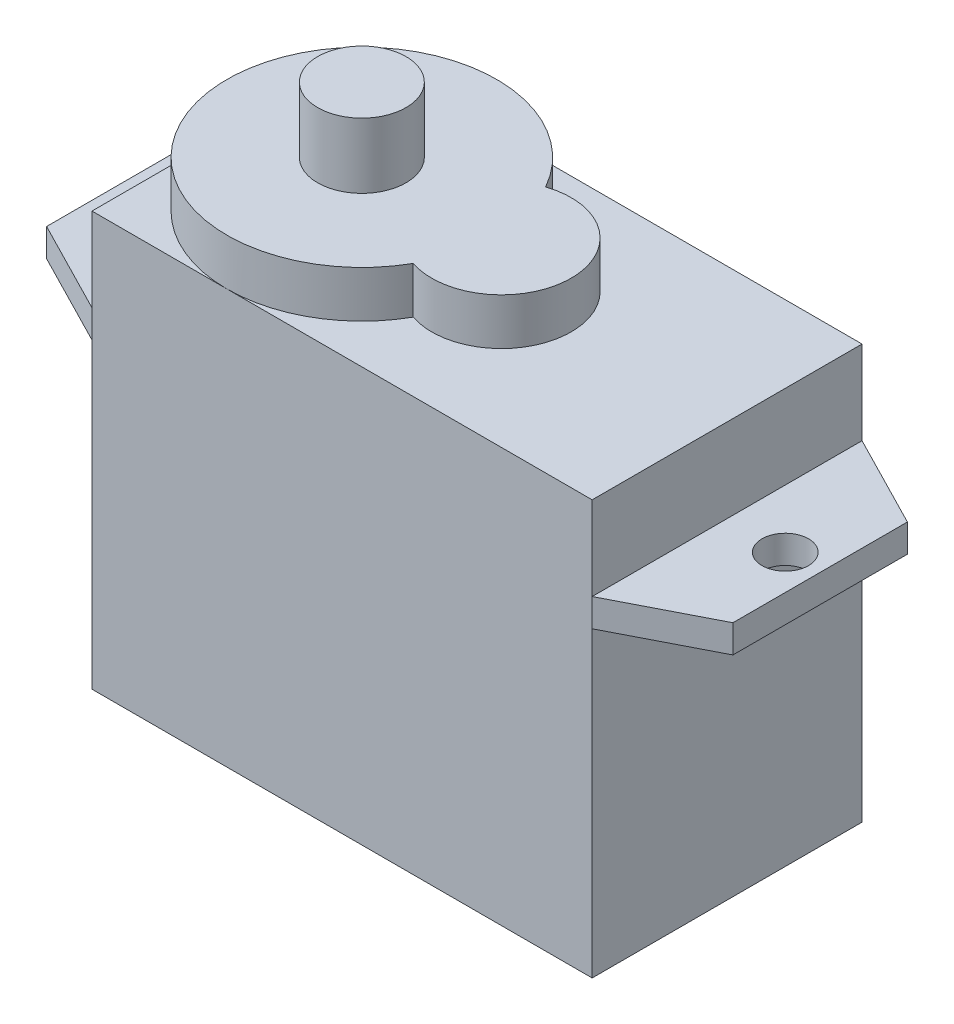
ISO-10303-21;
HEADER;
FILE_DESCRIPTION(('STEP AP214'),'2;1');
FILE_NAME('part.step','',(''),(''),'','','');
FILE_SCHEMA(('AUTOMOTIVE_DESIGN { 1 0 10303 214 1 1 1 1 }'));
ENDSEC;
DATA;
#1=APPLICATION_CONTEXT('core data for automotive mechanical design processes');
#2=APPLICATION_PROTOCOL_DEFINITION('international standard','automotive_design',2000,#1);
#3=PRODUCT_CONTEXT('',#1,'mechanical');
#4=PRODUCT('Part','Part','',(#3));
#5=PRODUCT_RELATED_PRODUCT_CATEGORY('part','',(#4));
#6=PRODUCT_DEFINITION_FORMATION('','',#4);
#7=PRODUCT_DEFINITION_CONTEXT('part definition',#1,'design');
#8=PRODUCT_DEFINITION('design','',#6,#7);
#9=PRODUCT_DEFINITION_SHAPE('','',#8);
#10=(LENGTH_UNIT() NAMED_UNIT(*) SI_UNIT(.MILLI.,.METRE.));
#11=(NAMED_UNIT(*) PLANE_ANGLE_UNIT() SI_UNIT($,.RADIAN.));
#12=(NAMED_UNIT(*) SI_UNIT($,.STERADIAN.) SOLID_ANGLE_UNIT());
#13=UNCERTAINTY_MEASURE_WITH_UNIT(LENGTH_MEASURE(1.E-05),#10,'distance_accuracy_value','');
#14=(GEOMETRIC_REPRESENTATION_CONTEXT(3) GLOBAL_UNCERTAINTY_ASSIGNED_CONTEXT((#13)) GLOBAL_UNIT_ASSIGNED_CONTEXT((#10,
#11,#12)) REPRESENTATION_CONTEXT('',''));
#15=CARTESIAN_POINT('',(0.,0.,0.));
#16=DIRECTION('',(0.,0.,1.));
#17=DIRECTION('',(1.,0.,0.));
#18=AXIS2_PLACEMENT_3D('',#15,#16,#17);
#19=CARTESIAN_POINT('',(0.,17.8,0.));
#20=DIRECTION('',(0.,1.,0.));
#21=DIRECTION('',(0.,0.,1.));
#22=AXIS2_PLACEMENT_3D('',#19,#20,#21);
#23=PLANE('',#22);
#24=CARTESIAN_POINT('',(1.05,17.8,0.));
#25=DIRECTION('',(0.,1.,0.));
#26=DIRECTION('',(0.,0.,1.));
#27=AXIS2_PLACEMENT_3D('',#24,#25,#26);
#28=CIRCLE('',#27,3.);
#29=CARTESIAN_POINT('',(0.103333333333326,17.8,2.84672131095094));
#30=VERTEX_POINT('',#29);
#31=CARTESIAN_POINT('',(0.103333333333326,17.8,-2.84672131095094));
#32=VERTEX_POINT('',#31);
#33=EDGE_CURVE('E161',#30,#32,#28,.T.);
#34=ORIENTED_EDGE('',*,*,#33,.F.);
#35=CARTESIAN_POINT('',(-4.95,17.8,0.));
#36=DIRECTION('',(0.,1.,0.));
#37=DIRECTION('',(0.,0.,1.));
#38=AXIS2_PLACEMENT_3D('',#35,#36,#37);
#39=CIRCLE('',#38,5.8);
#40=CARTESIAN_POINT('',(-4.95,17.8,5.8));
#41=VERTEX_POINT('',#40);
#42=EDGE_CURVE('E286',#41,#30,#39,.T.);
#43=ORIENTED_EDGE('',*,*,#42,.F.);
#44=DIRECTION('',(1.,0.,0.));
#45=VECTOR('',#44,1.);
#46=CARTESIAN_POINT('',(-10.75,17.8,5.8));
#47=LINE('',#46,#45);
#48=CARTESIAN_POINT('',(10.75,17.8,5.8));
#49=VERTEX_POINT('',#48);
#50=EDGE_CURVE('E171',#41,#49,#47,.T.);
#51=ORIENTED_EDGE('',*,*,#50,.T.);
#52=DIRECTION('',(0.,0.,-1.));
#53=VECTOR('',#52,1.);
#54=CARTESIAN_POINT('',(10.75,17.8,-5.8));
#55=LINE('',#54,#53);
#56=CARTESIAN_POINT('',(10.75,17.8,-5.8));
#57=VERTEX_POINT('',#56);
#58=EDGE_CURVE('E176',#49,#57,#55,.T.);
#59=ORIENTED_EDGE('',*,*,#58,.T.);
#60=DIRECTION('',(-1.,0.,0.));
#61=VECTOR('',#60,1.);
#62=CARTESIAN_POINT('',(-10.75,17.8,-5.8));
#63=LINE('',#62,#61);
#64=CARTESIAN_POINT('',(-4.95,17.8,-5.8));
#65=VERTEX_POINT('',#64);
#66=EDGE_CURVE('E179',#57,#65,#63,.T.);
#67=ORIENTED_EDGE('',*,*,#66,.T.);
#68=EDGE_CURVE('E44',#32,#65,#39,.T.);
#69=ORIENTED_EDGE('',*,*,#68,.F.);
#70=EDGE_LOOP('',(#34,#43,#51,#59,#67,#69));
#71=FACE_BOUND('',#70,.T.);
#72=ADVANCED_FACE('F33',(#71),#23,.T.);
#73=CARTESIAN_POINT('',(-10.75,17.8,0.));
#74=VERTEX_POINT('',#73);
#75=EDGE_CURVE('E11',#65,#74,#39,.T.);
#76=ORIENTED_EDGE('',*,*,#75,.F.);
#77=CARTESIAN_POINT('',(-10.75,17.8,-5.8));
#78=VERTEX_POINT('',#77);
#79=EDGE_CURVE('E178',#65,#78,#63,.T.);
#80=ORIENTED_EDGE('',*,*,#79,.T.);
#81=DIRECTION('',(0.,0.,1.));
#82=VECTOR('',#81,1.);
#83=CARTESIAN_POINT('',(-10.75,17.8,-5.8));
#84=LINE('',#83,#82);
#85=EDGE_CURVE('E169',#78,#74,#84,.T.);
#86=ORIENTED_EDGE('',*,*,#85,.T.);
#87=EDGE_LOOP('',(#76,#80,#86));
#88=FACE_BOUND('',#87,.T.);
#89=ADVANCED_FACE('F313',(#88),#23,.T.);
#90=CARTESIAN_POINT('',(0.,14.2,0.));
#91=DIRECTION('',(0.,1.,0.));
#92=DIRECTION('',(0.,0.,1.));
#93=AXIS2_PLACEMENT_3D('',#90,#91,#92);
#94=PLANE('',#93);
#95=DIRECTION('',(0.,0.,1.));
#96=VECTOR('',#95,1.);
#97=CARTESIAN_POINT('',(-10.75,14.2,-5.8));
#98=LINE('',#97,#96);
#99=CARTESIAN_POINT('',(-10.75,14.2,-5.8));
#100=VERTEX_POINT('',#99);
#101=CARTESIAN_POINT('',(-10.75,14.2,5.8));
#102=VERTEX_POINT('',#101);
#103=EDGE_CURVE('E162',#100,#102,#98,.T.);
#104=ORIENTED_EDGE('',*,*,#103,.F.);
#105=DIRECTION('',(-0.889933250556876,0.,0.456090790910399));
#106=VECTOR('',#105,1.);
#107=CARTESIAN_POINT('',(-10.75,14.2,-5.8));
#108=LINE('',#107,#106);
#109=CARTESIAN_POINT('',(-14.75,14.2,-3.75));
#110=VERTEX_POINT('',#109);
#111=EDGE_CURVE('E217',#100,#110,#108,.T.);
#112=ORIENTED_EDGE('',*,*,#111,.T.);
#113=DIRECTION('',(0.,0.,1.));
#114=VECTOR('',#113,1.);
#115=CARTESIAN_POINT('',(-14.75,14.2,-3.75));
#116=LINE('',#115,#114);
#117=CARTESIAN_POINT('',(-14.75,14.2,3.75));
#118=VERTEX_POINT('',#117);
#119=EDGE_CURVE('E219',#110,#118,#116,.T.);
#120=ORIENTED_EDGE('',*,*,#119,.T.);
#121=DIRECTION('',(0.889933250556876,0.,0.456090790910399));
#122=VECTOR('',#121,1.);
#123=CARTESIAN_POINT('',(-14.75,14.2,3.75));
#124=LINE('',#123,#122);
#125=EDGE_CURVE('E221',#118,#102,#124,.T.);
#126=ORIENTED_EDGE('',*,*,#125,.T.);
#127=EDGE_LOOP('',(#104,#112,#120,#126));
#128=FACE_BOUND('',#127,.T.);
#129=CARTESIAN_POINT('',(-13.25,14.2,0.));
#130=DIRECTION('',(0.,1.,0.));
#131=DIRECTION('',(0.,0.,1.));
#132=AXIS2_PLACEMENT_3D('',#129,#130,#131);
#133=CIRCLE('',#132,1.);
#134=CARTESIAN_POINT('',(-13.25,14.2,1.));
#135=VERTEX_POINT('',#134);
#136=EDGE_CURVE('E202',#135,#135,#133,.T.);
#137=ORIENTED_EDGE('',*,*,#136,.F.);
#138=EDGE_LOOP('',(#137));
#139=FACE_BOUND('',#138,.T.);
#140=ADVANCED_FACE('F320',(#128,#139),#94,.T.);
#141=CARTESIAN_POINT('',(10.75,13.,-5.8));
#142=DIRECTION('',(-1.,0.,0.));
#143=DIRECTION('',(0.,0.,1.));
#144=AXIS2_PLACEMENT_3D('',#141,#142,#143);
#145=PLANE('',#144);
#146=DIRECTION('',(0.,0.,-1.));
#147=VECTOR('',#146,1.);
#148=CARTESIAN_POINT('',(10.75,0.,-5.8));
#149=LINE('',#148,#147);
#150=CARTESIAN_POINT('',(10.75,0.,5.8));
#151=VERTEX_POINT('',#150);
#152=CARTESIAN_POINT('',(10.75,0.,-5.8));
#153=VERTEX_POINT('',#152);
#154=EDGE_CURVE('E260',#151,#153,#149,.T.);
#155=ORIENTED_EDGE('',*,*,#154,.T.);
#156=DIRECTION('',(0.,-1.,0.));
#157=VECTOR('',#156,1.);
#158=CARTESIAN_POINT('',(10.75,13.,-5.8));
#159=LINE('',#158,#157);
#160=CARTESIAN_POINT('',(10.75,13.,-5.8));
#161=VERTEX_POINT('',#160);
#162=EDGE_CURVE('E37',#161,#153,#159,.T.);
#163=ORIENTED_EDGE('',*,*,#162,.F.);
#164=DIRECTION('',(0.,0.,-1.));
#165=VECTOR('',#164,1.);
#166=CARTESIAN_POINT('',(10.75,13.,-5.8));
#167=LINE('',#166,#165);
#168=CARTESIAN_POINT('',(10.75,13.,5.8));
#169=VERTEX_POINT('',#168);
#170=EDGE_CURVE('E261',#169,#161,#167,.T.);
#171=ORIENTED_EDGE('',*,*,#170,.F.);
#172=DIRECTION('',(0.,-1.,0.));
#173=VECTOR('',#172,1.);
#174=CARTESIAN_POINT('',(10.75,13.,5.8));
#175=LINE('',#174,#173);
#176=EDGE_CURVE('E268',#169,#151,#175,.T.);
#177=ORIENTED_EDGE('',*,*,#176,.T.);
#178=EDGE_LOOP('',(#155,#163,#171,#177));
#179=FACE_BOUND('',#178,.T.);
#180=ADVANCED_FACE('F35',(#179),#145,.F.);
#181=CARTESIAN_POINT('',(-10.75,13.,-5.8));
#182=DIRECTION('',(0.,0.,1.));
#183=DIRECTION('',(1.,0.,0.));
#184=AXIS2_PLACEMENT_3D('',#181,#182,#183);
#185=PLANE('',#184);
#186=DIRECTION('',(-1.,0.,0.));
#187=VECTOR('',#186,1.);
#188=CARTESIAN_POINT('',(-10.75,0.,-5.8));
#189=LINE('',#188,#187);
#190=CARTESIAN_POINT('',(-10.75,0.,-5.8));
#191=VERTEX_POINT('',#190);
#192=EDGE_CURVE('E271',#153,#191,#189,.T.);
#193=ORIENTED_EDGE('',*,*,#192,.T.);
#194=DIRECTION('',(0.,-1.,0.));
#195=VECTOR('',#194,1.);
#196=CARTESIAN_POINT('',(-10.75,13.,-5.8));
#197=LINE('',#196,#195);
#198=CARTESIAN_POINT('',(-10.75,13.,-5.8));
#199=VERTEX_POINT('',#198);
#200=EDGE_CURVE('E280',#199,#191,#197,.T.);
#201=ORIENTED_EDGE('',*,*,#200,.F.);
#202=DIRECTION('',(0.,-1.,0.));
#203=VECTOR('',#202,1.);
#204=CARTESIAN_POINT('',(-10.75,14.2,-5.8));
#205=LINE('',#204,#203);
#206=EDGE_CURVE('E248',#100,#199,#205,.T.);
#207=ORIENTED_EDGE('',*,*,#206,.F.);
#208=DIRECTION('',(0.,-1.,0.));
#209=VECTOR('',#208,1.);
#210=CARTESIAN_POINT('',(-10.75,17.8,-5.8));
#211=LINE('',#210,#209);
#212=EDGE_CURVE('E180',#78,#100,#211,.T.);
#213=ORIENTED_EDGE('',*,*,#212,.F.);
#214=ORIENTED_EDGE('',*,*,#79,.F.);
#215=ORIENTED_EDGE('',*,*,#66,.F.);
#216=DIRECTION('',(0.,-1.,0.));
#217=VECTOR('',#216,1.);
#218=CARTESIAN_POINT('',(10.75,17.8,-5.8));
#219=LINE('',#218,#217);
#220=CARTESIAN_POINT('',(10.75,14.2,-5.8));
#221=VERTEX_POINT('',#220);
#222=EDGE_CURVE('E186',#57,#221,#219,.T.);
#223=ORIENTED_EDGE('',*,*,#222,.T.);
#224=DIRECTION('',(0.,-1.,0.));
#225=VECTOR('',#224,1.);
#226=CARTESIAN_POINT('',(10.75,14.2,-5.8));
#227=LINE('',#226,#225);
#228=EDGE_CURVE('E251',#221,#161,#227,.T.);
#229=ORIENTED_EDGE('',*,*,#228,.T.);
#230=ORIENTED_EDGE('',*,*,#162,.T.);
#231=EDGE_LOOP('',(#193,#201,#207,#213,#214,#215,#223,#229,#230));
#232=FACE_BOUND('',#231,.T.);
#233=ADVANCED_FACE('F342',(#232),#185,.F.);
#234=CARTESIAN_POINT('',(-10.75,13.,-5.8));
#235=DIRECTION('',(1.,0.,0.));
#236=DIRECTION('',(0.,0.,-1.));
#237=AXIS2_PLACEMENT_3D('',#234,#235,#236);
#238=PLANE('',#237);
#239=DIRECTION('',(0.,0.,1.));
#240=VECTOR('',#239,1.);
#241=CARTESIAN_POINT('',(-10.75,0.,-5.8));
#242=LINE('',#241,#240);
#243=CARTESIAN_POINT('',(-10.75,0.,5.8));
#244=VERTEX_POINT('',#243);
#245=EDGE_CURVE('E273',#191,#244,#242,.T.);
#246=ORIENTED_EDGE('',*,*,#245,.T.);
#247=DIRECTION('',(0.,-1.,0.));
#248=VECTOR('',#247,1.);
#249=CARTESIAN_POINT('',(-10.75,13.,5.8));
#250=LINE('',#249,#248);
#251=CARTESIAN_POINT('',(-10.75,13.,5.8));
#252=VERTEX_POINT('',#251);
#253=EDGE_CURVE('E278',#252,#244,#250,.T.);
#254=ORIENTED_EDGE('',*,*,#253,.F.);
#255=DIRECTION('',(0.,0.,1.));
#256=VECTOR('',#255,1.);
#257=CARTESIAN_POINT('',(-10.75,13.,-5.8));
#258=LINE('',#257,#256);
#259=EDGE_CURVE('E264',#199,#252,#258,.T.);
#260=ORIENTED_EDGE('',*,*,#259,.F.);
#261=ORIENTED_EDGE('',*,*,#200,.T.);
#262=EDGE_LOOP('',(#246,#254,#260,#261));
#263=FACE_BOUND('',#262,.T.);
#264=ADVANCED_FACE('F384',(#263),#238,.F.);
#265=CARTESIAN_POINT('',(-10.75,13.,5.8));
#266=DIRECTION('',(0.,0.,-1.));
#267=DIRECTION('',(-1.,0.,0.));
#268=AXIS2_PLACEMENT_3D('',#265,#266,#267);
#269=PLANE('',#268);
#270=DIRECTION('',(1.,0.,0.));
#271=VECTOR('',#270,1.);
#272=CARTESIAN_POINT('',(-10.75,0.,5.8));
#273=LINE('',#272,#271);
#274=EDGE_CURVE('E265',#244,#151,#273,.T.);
#275=ORIENTED_EDGE('',*,*,#274,.T.);
#276=ORIENTED_EDGE('',*,*,#176,.F.);
#277=DIRECTION('',(0.,-1.,0.));
#278=VECTOR('',#277,1.);
#279=CARTESIAN_POINT('',(10.75,14.2,5.8));
#280=LINE('',#279,#278);
#281=CARTESIAN_POINT('',(10.75,14.2,5.8));
#282=VERTEX_POINT('',#281);
#283=EDGE_CURVE('E223',#282,#169,#280,.T.);
#284=ORIENTED_EDGE('',*,*,#283,.F.);
#285=DIRECTION('',(0.,-1.,0.));
#286=VECTOR('',#285,1.);
#287=CARTESIAN_POINT('',(10.75,17.8,5.8));
#288=LINE('',#287,#286);
#289=EDGE_CURVE('E189',#49,#282,#288,.T.);
#290=ORIENTED_EDGE('',*,*,#289,.F.);
#291=ORIENTED_EDGE('',*,*,#50,.F.);
#292=CARTESIAN_POINT('',(-10.75,17.8,5.8));
#293=VERTEX_POINT('',#292);
#294=EDGE_CURVE('E173',#293,#41,#47,.T.);
#295=ORIENTED_EDGE('',*,*,#294,.F.);
#296=DIRECTION('',(0.,-1.,0.));
#297=VECTOR('',#296,1.);
#298=CARTESIAN_POINT('',(-10.75,17.8,5.8));
#299=LINE('',#298,#297);
#300=EDGE_CURVE('E192',#293,#102,#299,.T.);
#301=ORIENTED_EDGE('',*,*,#300,.T.);
#302=DIRECTION('',(0.,-1.,0.));
#303=VECTOR('',#302,1.);
#304=CARTESIAN_POINT('',(-10.75,14.2,5.8));
#305=LINE('',#304,#303);
#306=EDGE_CURVE('E239',#102,#252,#305,.T.);
#307=ORIENTED_EDGE('',*,*,#306,.T.);
#308=ORIENTED_EDGE('',*,*,#253,.T.);
#309=EDGE_LOOP('',(#275,#276,#284,#290,#291,#295,#301,#307,#308));
#310=FACE_BOUND('',#309,.T.);
#311=ADVANCED_FACE('F355',(#310),#269,.F.);
#312=CARTESIAN_POINT('',(0.,0.,0.));
#313=DIRECTION('',(0.,1.,0.));
#314=DIRECTION('',(0.,0.,1.));
#315=AXIS2_PLACEMENT_3D('',#312,#313,#314);
#316=PLANE('',#315);
#317=ORIENTED_EDGE('',*,*,#154,.F.);
#318=ORIENTED_EDGE('',*,*,#274,.F.);
#319=ORIENTED_EDGE('',*,*,#245,.F.);
#320=ORIENTED_EDGE('',*,*,#192,.F.);
#321=EDGE_LOOP('',(#317,#318,#319,#320));
#322=FACE_BOUND('',#321,.T.);
#323=ADVANCED_FACE('F383',(#322),#316,.F.);
#324=CARTESIAN_POINT('',(0.,13.,0.));
#325=DIRECTION('',(0.,1.,0.));
#326=DIRECTION('',(0.,0.,1.));
#327=AXIS2_PLACEMENT_3D('',#324,#325,#326);
#328=PLANE('',#327);
#329=CARTESIAN_POINT('',(13.25,13.,0.));
#330=DIRECTION('',(0.,1.,0.));
#331=DIRECTION('',(0.,0.,-1.));
#332=AXIS2_PLACEMENT_3D('',#329,#330,#331);
#333=CIRCLE('',#332,1.);
#334=CARTESIAN_POINT('',(13.25,13.,-1.));
#335=VERTEX_POINT('',#334);
#336=EDGE_CURVE('E195',#335,#335,#333,.T.);
#337=ORIENTED_EDGE('',*,*,#336,.T.);
#338=EDGE_LOOP('',(#337));
#339=FACE_BOUND('',#338,.T.);
#340=DIRECTION('',(0.889933250556876,0.,-0.456090790910399));
#341=VECTOR('',#340,1.);
#342=CARTESIAN_POINT('',(14.75,13.,3.75));
#343=LINE('',#342,#341);
#344=CARTESIAN_POINT('',(14.75,13.,3.75));
#345=VERTEX_POINT('',#344);
#346=EDGE_CURVE('E205',#169,#345,#343,.T.);
#347=ORIENTED_EDGE('',*,*,#346,.F.);
#348=ORIENTED_EDGE('',*,*,#170,.T.);
#349=DIRECTION('',(-0.889933250556876,0.,-0.456090790910399));
#350=VECTOR('',#349,1.);
#351=CARTESIAN_POINT('',(10.75,13.,-5.8));
#352=LINE('',#351,#350);
#353=CARTESIAN_POINT('',(14.75,13.,-3.75));
#354=VERTEX_POINT('',#353);
#355=EDGE_CURVE('E228',#354,#161,#352,.T.);
#356=ORIENTED_EDGE('',*,*,#355,.F.);
#357=DIRECTION('',(0.,0.,-1.));
#358=VECTOR('',#357,1.);
#359=CARTESIAN_POINT('',(14.75,13.,-3.75));
#360=LINE('',#359,#358);
#361=EDGE_CURVE('E226',#345,#354,#360,.T.);
#362=ORIENTED_EDGE('',*,*,#361,.F.);
#363=EDGE_LOOP('',(#347,#348,#356,#362));
#364=FACE_BOUND('',#363,.T.);
#365=ADVANCED_FACE('F375',(#339,#364),#328,.F.);
#366=CARTESIAN_POINT('',(-13.25,13.,0.));
#367=DIRECTION('',(0.,1.,0.));
#368=DIRECTION('',(0.,0.,1.));
#369=AXIS2_PLACEMENT_3D('',#366,#367,#368);
#370=CIRCLE('',#369,1.);
#371=CARTESIAN_POINT('',(-13.25,13.,1.));
#372=VERTEX_POINT('',#371);
#373=EDGE_CURVE('E199',#372,#372,#370,.T.);
#374=ORIENTED_EDGE('',*,*,#373,.T.);
#375=EDGE_LOOP('',(#374));
#376=FACE_BOUND('',#375,.T.);
#377=DIRECTION('',(-0.889933250556876,0.,0.456090790910399));
#378=VECTOR('',#377,1.);
#379=CARTESIAN_POINT('',(-10.75,13.,-5.8));
#380=LINE('',#379,#378);
#381=CARTESIAN_POINT('',(-14.75,13.,-3.75));
#382=VERTEX_POINT('',#381);
#383=EDGE_CURVE('E231',#199,#382,#380,.T.);
#384=ORIENTED_EDGE('',*,*,#383,.F.);
#385=ORIENTED_EDGE('',*,*,#259,.T.);
#386=DIRECTION('',(0.889933250556876,0.,0.456090790910399));
#387=VECTOR('',#386,1.);
#388=CARTESIAN_POINT('',(-14.75,13.,3.75));
#389=LINE('',#388,#387);
#390=CARTESIAN_POINT('',(-14.75,13.,3.75));
#391=VERTEX_POINT('',#390);
#392=EDGE_CURVE('E212',#391,#252,#389,.T.);
#393=ORIENTED_EDGE('',*,*,#392,.F.);
#394=DIRECTION('',(0.,0.,1.));
#395=VECTOR('',#394,1.);
#396=CARTESIAN_POINT('',(-14.75,13.,-3.75));
#397=LINE('',#396,#395);
#398=EDGE_CURVE('E233',#382,#391,#397,.T.);
#399=ORIENTED_EDGE('',*,*,#398,.F.);
#400=EDGE_LOOP('',(#384,#385,#393,#399));
#401=FACE_BOUND('',#400,.T.);
#402=ADVANCED_FACE('F390',(#376,#401),#328,.F.);
#403=DIRECTION('',(0.,0.,-1.));
#404=VECTOR('',#403,1.);
#405=CARTESIAN_POINT('',(10.75,14.2,-5.8));
#406=LINE('',#405,#404);
#407=EDGE_CURVE('E165',#282,#221,#406,.T.);
#408=ORIENTED_EDGE('',*,*,#407,.F.);
#409=DIRECTION('',(0.889933250556876,0.,-0.456090790910399));
#410=VECTOR('',#409,1.);
#411=CARTESIAN_POINT('',(14.75,14.2,3.75));
#412=LINE('',#411,#410);
#413=CARTESIAN_POINT('',(14.75,14.2,3.75));
#414=VERTEX_POINT('',#413);
#415=EDGE_CURVE('E208',#282,#414,#412,.T.);
#416=ORIENTED_EDGE('',*,*,#415,.T.);
#417=DIRECTION('',(0.,0.,-1.));
#418=VECTOR('',#417,1.);
#419=CARTESIAN_POINT('',(14.75,14.2,-3.75));
#420=LINE('',#419,#418);
#421=CARTESIAN_POINT('',(14.75,14.2,-3.75));
#422=VERTEX_POINT('',#421);
#423=EDGE_CURVE('E211',#414,#422,#420,.T.);
#424=ORIENTED_EDGE('',*,*,#423,.T.);
#425=DIRECTION('',(-0.889933250556876,0.,-0.456090790910399));
#426=VECTOR('',#425,1.);
#427=CARTESIAN_POINT('',(10.75,14.2,-5.8));
#428=LINE('',#427,#426);
#429=EDGE_CURVE('E214',#422,#221,#428,.T.);
#430=ORIENTED_EDGE('',*,*,#429,.T.);
#431=EDGE_LOOP('',(#408,#416,#424,#430));
#432=FACE_BOUND('',#431,.T.);
#433=CARTESIAN_POINT('',(13.25,14.2,0.));
#434=DIRECTION('',(0.,1.,0.));
#435=DIRECTION('',(0.,0.,-1.));
#436=AXIS2_PLACEMENT_3D('',#433,#434,#435);
#437=CIRCLE('',#436,1.);
#438=CARTESIAN_POINT('',(13.25,14.2,-1.));
#439=VERTEX_POINT('',#438);
#440=EDGE_CURVE('E196',#439,#439,#437,.T.);
#441=ORIENTED_EDGE('',*,*,#440,.F.);
#442=EDGE_LOOP('',(#441));
#443=FACE_BOUND('',#442,.T.);
#444=ADVANCED_FACE('F366',(#432,#443),#94,.T.);
#445=CARTESIAN_POINT('',(14.75,14.2,3.75));
#446=DIRECTION('',(-0.456090790910399,0.,-0.889933250556876));
#447=DIRECTION('',(-0.889933250556876,0.,0.456090790910399));
#448=AXIS2_PLACEMENT_3D('',#445,#446,#447);
#449=PLANE('',#448);
#450=ORIENTED_EDGE('',*,*,#346,.T.);
#451=DIRECTION('',(0.,-1.,0.));
#452=VECTOR('',#451,1.);
#453=CARTESIAN_POINT('',(14.75,14.2,3.75));
#454=LINE('',#453,#452);
#455=EDGE_CURVE('E257',#414,#345,#454,.T.);
#456=ORIENTED_EDGE('',*,*,#455,.F.);
#457=ORIENTED_EDGE('',*,*,#415,.F.);
#458=ORIENTED_EDGE('',*,*,#283,.T.);
#459=EDGE_LOOP('',(#450,#456,#457,#458));
#460=FACE_BOUND('',#459,.T.);
#461=ADVANCED_FACE('F380',(#460),#449,.F.);
#462=CARTESIAN_POINT('',(14.75,14.2,-3.75));
#463=DIRECTION('',(-1.,0.,0.));
#464=DIRECTION('',(0.,0.,1.));
#465=AXIS2_PLACEMENT_3D('',#462,#463,#464);
#466=PLANE('',#465);
#467=ORIENTED_EDGE('',*,*,#361,.T.);
#468=DIRECTION('',(0.,-1.,0.));
#469=VECTOR('',#468,1.);
#470=CARTESIAN_POINT('',(14.75,14.2,-3.75));
#471=LINE('',#470,#469);
#472=EDGE_CURVE('E254',#422,#354,#471,.T.);
#473=ORIENTED_EDGE('',*,*,#472,.F.);
#474=ORIENTED_EDGE('',*,*,#423,.F.);
#475=ORIENTED_EDGE('',*,*,#455,.T.);
#476=EDGE_LOOP('',(#467,#473,#474,#475));
#477=FACE_BOUND('',#476,.T.);
#478=ADVANCED_FACE('F372',(#477),#466,.F.);
#479=CARTESIAN_POINT('',(10.75,14.2,-5.8));
#480=DIRECTION('',(-0.456090790910399,0.,0.889933250556876));
#481=DIRECTION('',(0.889933250556876,0.,0.456090790910399));
#482=AXIS2_PLACEMENT_3D('',#479,#480,#481);
#483=PLANE('',#482);
#484=ORIENTED_EDGE('',*,*,#355,.T.);
#485=ORIENTED_EDGE('',*,*,#228,.F.);
#486=ORIENTED_EDGE('',*,*,#429,.F.);
#487=ORIENTED_EDGE('',*,*,#472,.T.);
#488=EDGE_LOOP('',(#484,#485,#486,#487));
#489=FACE_BOUND('',#488,.T.);
#490=ADVANCED_FACE('F363',(#489),#483,.F.);
#491=CARTESIAN_POINT('',(-10.75,14.2,-5.8));
#492=DIRECTION('',(0.456090790910399,0.,0.889933250556876));
#493=DIRECTION('',(0.889933250556876,0.,-0.456090790910399));
#494=AXIS2_PLACEMENT_3D('',#491,#492,#493);
#495=PLANE('',#494);
#496=ORIENTED_EDGE('',*,*,#383,.T.);
#497=DIRECTION('',(0.,-1.,0.));
#498=VECTOR('',#497,1.);
#499=CARTESIAN_POINT('',(-14.75,14.2,-3.75));
#500=LINE('',#499,#498);
#501=EDGE_CURVE('E245',#110,#382,#500,.T.);
#502=ORIENTED_EDGE('',*,*,#501,.F.);
#503=ORIENTED_EDGE('',*,*,#111,.F.);
#504=ORIENTED_EDGE('',*,*,#206,.T.);
#505=EDGE_LOOP('',(#496,#502,#503,#504));
#506=FACE_BOUND('',#505,.T.);
#507=ADVANCED_FACE('F388',(#506),#495,.F.);
#508=CARTESIAN_POINT('',(-14.75,14.2,-3.75));
#509=DIRECTION('',(1.,0.,0.));
#510=DIRECTION('',(0.,0.,-1.));
#511=AXIS2_PLACEMENT_3D('',#508,#509,#510);
#512=PLANE('',#511);
#513=ORIENTED_EDGE('',*,*,#398,.T.);
#514=DIRECTION('',(0.,-1.,0.));
#515=VECTOR('',#514,1.);
#516=CARTESIAN_POINT('',(-14.75,14.2,3.75));
#517=LINE('',#516,#515);
#518=EDGE_CURVE('E242',#118,#391,#517,.T.);
#519=ORIENTED_EDGE('',*,*,#518,.F.);
#520=ORIENTED_EDGE('',*,*,#119,.F.);
#521=ORIENTED_EDGE('',*,*,#501,.T.);
#522=EDGE_LOOP('',(#513,#519,#520,#521));
#523=FACE_BOUND('',#522,.T.);
#524=ADVANCED_FACE('F392',(#523),#512,.F.);
#525=CARTESIAN_POINT('',(-14.75,14.2,3.75));
#526=DIRECTION('',(0.456090790910399,0.,-0.889933250556876));
#527=DIRECTION('',(-0.889933250556876,0.,-0.456090790910399));
#528=AXIS2_PLACEMENT_3D('',#525,#526,#527);
#529=PLANE('',#528);
#530=ORIENTED_EDGE('',*,*,#392,.T.);
#531=ORIENTED_EDGE('',*,*,#306,.F.);
#532=ORIENTED_EDGE('',*,*,#125,.F.);
#533=ORIENTED_EDGE('',*,*,#518,.T.);
#534=EDGE_LOOP('',(#530,#531,#532,#533));
#535=FACE_BOUND('',#534,.T.);
#536=ADVANCED_FACE('F352',(#535),#529,.F.);
#537=CARTESIAN_POINT('',(-13.25,14.2,0.));
#538=DIRECTION('',(0.,-1.,0.));
#539=DIRECTION('',(0.,0.,-1.));
#540=AXIS2_PLACEMENT_3D('',#537,#538,#539);
#541=CYLINDRICAL_SURFACE('',#540,1.);
#542=ORIENTED_EDGE('',*,*,#136,.T.);
#543=EDGE_LOOP('',(#542));
#544=FACE_BOUND('',#543,.T.);
#545=ORIENTED_EDGE('',*,*,#373,.F.);
#546=EDGE_LOOP('',(#545));
#547=FACE_BOUND('',#546,.T.);
#548=ADVANCED_FACE('F399',(#544,#547),#541,.F.);
#549=CARTESIAN_POINT('',(13.25,14.2,0.));
#550=DIRECTION('',(0.,-1.,0.));
#551=DIRECTION('',(0.,0.,-1.));
#552=AXIS2_PLACEMENT_3D('',#549,#550,#551);
#553=CYLINDRICAL_SURFACE('',#552,1.);
#554=ORIENTED_EDGE('',*,*,#440,.T.);
#555=EDGE_LOOP('',(#554));
#556=FACE_BOUND('',#555,.T.);
#557=ORIENTED_EDGE('',*,*,#336,.F.);
#558=EDGE_LOOP('',(#557));
#559=FACE_BOUND('',#558,.T.);
#560=ADVANCED_FACE('F438',(#556,#559),#553,.F.);
#561=CARTESIAN_POINT('',(-10.75,17.8,-5.8));
#562=DIRECTION('',(1.,0.,0.));
#563=DIRECTION('',(0.,0.,-1.));
#564=AXIS2_PLACEMENT_3D('',#561,#562,#563);
#565=PLANE('',#564);
#566=ORIENTED_EDGE('',*,*,#103,.T.);
#567=ORIENTED_EDGE('',*,*,#300,.F.);
#568=EDGE_CURVE('E172',#74,#293,#84,.T.);
#569=ORIENTED_EDGE('',*,*,#568,.F.);
#570=ORIENTED_EDGE('',*,*,#85,.F.);
#571=ORIENTED_EDGE('',*,*,#212,.T.);
#572=EDGE_LOOP('',(#566,#567,#569,#570,#571));
#573=FACE_BOUND('',#572,.T.);
#574=ADVANCED_FACE('F332',(#573),#565,.F.);
#575=CARTESIAN_POINT('',(10.75,17.8,-5.8));
#576=DIRECTION('',(-1.,0.,0.));
#577=DIRECTION('',(0.,0.,1.));
#578=AXIS2_PLACEMENT_3D('',#575,#576,#577);
#579=PLANE('',#578);
#580=ORIENTED_EDGE('',*,*,#407,.T.);
#581=ORIENTED_EDGE('',*,*,#222,.F.);
#582=ORIENTED_EDGE('',*,*,#58,.F.);
#583=ORIENTED_EDGE('',*,*,#289,.T.);
#584=EDGE_LOOP('',(#580,#581,#582,#583));
#585=FACE_BOUND('',#584,.T.);
#586=ADVANCED_FACE('F324',(#585),#579,.F.);
#587=EDGE_CURVE('E42',#74,#41,#39,.T.);
#588=ORIENTED_EDGE('',*,*,#587,.F.);
#589=ORIENTED_EDGE('',*,*,#568,.T.);
#590=ORIENTED_EDGE('',*,*,#294,.T.);
#591=EDGE_LOOP('',(#588,#589,#590));
#592=FACE_BOUND('',#591,.T.);
#593=ADVANCED_FACE('F315',(#592),#23,.T.);
#594=CARTESIAN_POINT('',(1.05,19.8,0.));
#595=DIRECTION('',(0.,-1.,0.));
#596=DIRECTION('',(0.,0.,-1.));
#597=AXIS2_PLACEMENT_3D('',#594,#595,#596);
#598=CYLINDRICAL_SURFACE('',#597,3.);
#599=ORIENTED_EDGE('',*,*,#33,.T.);
#600=DIRECTION('',(0.,-1.,0.));
#601=VECTOR('',#600,1.);
#602=CARTESIAN_POINT('',(0.103333333333326,19.8,-2.84672131095094));
#603=LINE('',#602,#601);
#604=CARTESIAN_POINT('',(0.103333333333326,19.8,-2.84672131095094));
#605=VERTEX_POINT('',#604);
#606=EDGE_CURVE('E148',#605,#32,#603,.T.);
#607=ORIENTED_EDGE('',*,*,#606,.F.);
#608=CARTESIAN_POINT('',(1.05,19.8,0.));
#609=DIRECTION('',(0.,1.,0.));
#610=DIRECTION('',(0.,0.,1.));
#611=AXIS2_PLACEMENT_3D('',#608,#609,#610);
#612=CIRCLE('',#611,3.);
#613=CARTESIAN_POINT('',(0.103333333333326,19.8,2.84672131095094));
#614=VERTEX_POINT('',#613);
#615=EDGE_CURVE('E155',#614,#605,#612,.T.);
#616=ORIENTED_EDGE('',*,*,#615,.F.);
#617=DIRECTION('',(0.,-1.,0.));
#618=VECTOR('',#617,1.);
#619=CARTESIAN_POINT('',(0.103333333333326,19.8,2.84672131095094));
#620=LINE('',#619,#618);
#621=EDGE_CURVE('E152',#614,#30,#620,.T.);
#622=ORIENTED_EDGE('',*,*,#621,.T.);
#623=EDGE_LOOP('',(#599,#607,#616,#622));
#624=FACE_BOUND('',#623,.T.);
#625=ADVANCED_FACE('F160',(#624),#598,.T.);
#626=CARTESIAN_POINT('',(-4.95,19.8,0.));
#627=DIRECTION('',(0.,-1.,0.));
#628=DIRECTION('',(0.,0.,-1.));
#629=AXIS2_PLACEMENT_3D('',#626,#627,#628);
#630=CYLINDRICAL_SURFACE('',#629,5.8);
#631=ORIENTED_EDGE('',*,*,#68,.T.);
#632=ORIENTED_EDGE('',*,*,#75,.T.);
#633=ORIENTED_EDGE('',*,*,#587,.T.);
#634=ORIENTED_EDGE('',*,*,#42,.T.);
#635=ORIENTED_EDGE('',*,*,#621,.F.);
#636=CARTESIAN_POINT('',(-4.95,19.8,0.));
#637=DIRECTION('',(0.,1.,0.));
#638=DIRECTION('',(0.,0.,1.));
#639=AXIS2_PLACEMENT_3D('',#636,#637,#638);
#640=CIRCLE('',#639,5.8);
#641=EDGE_CURVE('E144',#605,#614,#640,.T.);
#642=ORIENTED_EDGE('',*,*,#641,.F.);
#643=ORIENTED_EDGE('',*,*,#606,.T.);
#644=EDGE_LOOP('',(#631,#632,#633,#634,#635,#642,#643));
#645=FACE_BOUND('',#644,.T.);
#646=ADVANCED_FACE('F146',(#645),#630,.T.);
#647=CARTESIAN_POINT('',(-1.95,19.8,0.));
#648=DIRECTION('',(0.,1.,0.));
#649=DIRECTION('',(0.,0.,1.));
#650=AXIS2_PLACEMENT_3D('',#647,#648,#649);
#651=PLANE('',#650);
#652=CARTESIAN_POINT('',(-4.95,19.8,0.));
#653=DIRECTION('',(0.,1.,0.));
#654=DIRECTION('',(0.,0.,1.));
#655=AXIS2_PLACEMENT_3D('',#652,#653,#654);
#656=CIRCLE('',#655,1.9);
#657=CARTESIAN_POINT('',(-4.95,19.8,1.9));
#658=VERTEX_POINT('',#657);
#659=EDGE_CURVE('E292',#658,#658,#656,.T.);
#660=ORIENTED_EDGE('',*,*,#659,.F.);
#661=EDGE_LOOP('',(#660));
#662=FACE_BOUND('',#661,.T.);
#663=ORIENTED_EDGE('',*,*,#615,.T.);
#664=ORIENTED_EDGE('',*,*,#641,.T.);
#665=EDGE_LOOP('',(#663,#664));
#666=FACE_BOUND('',#665,.T.);
#667=ADVANCED_FACE('F157',(#662,#666),#651,.T.);
#668=CARTESIAN_POINT('',(-4.95,22.6,0.));
#669=DIRECTION('',(0.,-1.,0.));
#670=DIRECTION('',(0.,0.,-1.));
#671=AXIS2_PLACEMENT_3D('',#668,#669,#670);
#672=CYLINDRICAL_SURFACE('',#671,1.9);
#673=CARTESIAN_POINT('',(-4.95,22.6,0.));
#674=DIRECTION('',(0.,1.,0.));
#675=DIRECTION('',(0.,0.,1.));
#676=AXIS2_PLACEMENT_3D('',#673,#674,#675);
#677=CIRCLE('',#676,1.9);
#678=CARTESIAN_POINT('',(-4.95,22.6,1.9));
#679=VERTEX_POINT('',#678);
#680=EDGE_CURVE('E290',#679,#679,#677,.T.);
#681=ORIENTED_EDGE('',*,*,#680,.F.);
#682=EDGE_LOOP('',(#681));
#683=FACE_BOUND('',#682,.T.);
#684=ORIENTED_EDGE('',*,*,#659,.T.);
#685=EDGE_LOOP('',(#684));
#686=FACE_BOUND('',#685,.T.);
#687=ADVANCED_FACE('F298',(#683,#686),#672,.T.);
#688=CARTESIAN_POINT('',(-4.95,22.6,0.));
#689=DIRECTION('',(0.,1.,0.));
#690=DIRECTION('',(0.,0.,1.));
#691=AXIS2_PLACEMENT_3D('',#688,#689,#690);
#692=PLANE('',#691);
#693=ORIENTED_EDGE('',*,*,#680,.T.);
#694=EDGE_LOOP('',(#693));
#695=FACE_BOUND('',#694,.T.);
#696=ADVANCED_FACE('F307',(#695),#692,.T.);
#697=CLOSED_SHELL('',(#72,#89,#140,#180,#233,#264,#311,#323,#365,#402,#444,#461,#478,#490,#507,
#524,#536,#548,#560,#574,#586,#593,#625,#646,#667,#687,#696));
#698=MANIFOLD_SOLID_BREP('B2',#697);
#699=ADVANCED_BREP_SHAPE_REPRESENTATION('',(#18,#698),#14);
#700=SHAPE_DEFINITION_REPRESENTATION(#9,#699);
ENDSEC;
END-ISO-10303-21;
